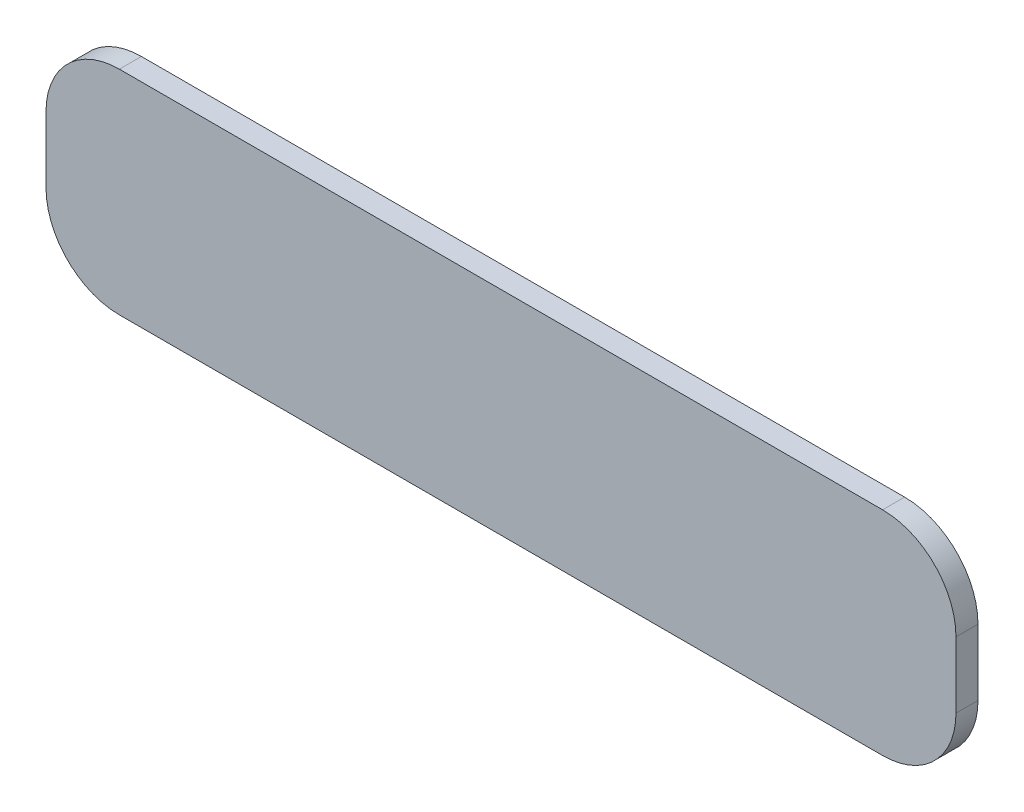
ISO-10303-21;
HEADER;
FILE_DESCRIPTION(('STEP AP214'),'2;1');
FILE_NAME('part.step','',(''),(''),'','','');
FILE_SCHEMA(('AUTOMOTIVE_DESIGN { 1 0 10303 214 1 1 1 1 }'));
ENDSEC;
DATA;
#1=APPLICATION_CONTEXT('core data for automotive mechanical design processes');
#2=APPLICATION_PROTOCOL_DEFINITION('international standard','automotive_design',2000,#1);
#3=PRODUCT_CONTEXT('',#1,'mechanical');
#4=PRODUCT('Part','Part','',(#3));
#5=PRODUCT_RELATED_PRODUCT_CATEGORY('part','',(#4));
#6=PRODUCT_DEFINITION_FORMATION('','',#4);
#7=PRODUCT_DEFINITION_CONTEXT('part definition',#1,'design');
#8=PRODUCT_DEFINITION('design','',#6,#7);
#9=PRODUCT_DEFINITION_SHAPE('','',#8);
#10=(LENGTH_UNIT() NAMED_UNIT(*) SI_UNIT(.MILLI.,.METRE.));
#11=(NAMED_UNIT(*) PLANE_ANGLE_UNIT() SI_UNIT($,.RADIAN.));
#12=(NAMED_UNIT(*) SI_UNIT($,.STERADIAN.) SOLID_ANGLE_UNIT());
#13=UNCERTAINTY_MEASURE_WITH_UNIT(LENGTH_MEASURE(1.E-05),#10,'distance_accuracy_value','');
#14=(GEOMETRIC_REPRESENTATION_CONTEXT(3) GLOBAL_UNCERTAINTY_ASSIGNED_CONTEXT((#13)) GLOBAL_UNIT_ASSIGNED_CONTEXT((#10,
#11,#12)) REPRESENTATION_CONTEXT('',''));
#15=CARTESIAN_POINT('',(0.,0.,0.));
#16=DIRECTION('',(0.,0.,1.));
#17=DIRECTION('',(1.,0.,0.));
#18=AXIS2_PLACEMENT_3D('',#15,#16,#17);
#19=CARTESIAN_POINT('',(-62.,14.5,3.));
#20=DIRECTION('',(1.,0.,0.));
#21=DIRECTION('',(0.,0.,-1.));
#22=AXIS2_PLACEMENT_3D('',#19,#20,#21);
#23=PLANE('',#22);
#24=DIRECTION('',(0.,-1.,0.));
#25=VECTOR('',#24,1.);
#26=CARTESIAN_POINT('',(-62.,14.5,0.));
#27=LINE('',#26,#25);
#28=CARTESIAN_POINT('',(-62.,4.5,0.));
#29=VERTEX_POINT('',#28);
#30=CARTESIAN_POINT('',(-62.,-4.5,0.));
#31=VERTEX_POINT('',#30);
#32=EDGE_CURVE('E158',#29,#31,#27,.T.);
#33=ORIENTED_EDGE('',*,*,#32,.T.);
#34=DIRECTION('',(0.,0.,-1.));
#35=VECTOR('',#34,1.);
#36=CARTESIAN_POINT('',(-62.,-4.5,3.));
#37=LINE('',#36,#35);
#38=CARTESIAN_POINT('',(-62.,-4.5,3.));
#39=VERTEX_POINT('',#38);
#40=EDGE_CURVE('E11',#31,#39,#37,.F.);
#41=ORIENTED_EDGE('',*,*,#40,.T.);
#42=DIRECTION('',(0.,-1.,0.));
#43=VECTOR('',#42,1.);
#44=CARTESIAN_POINT('',(-62.,14.5,3.));
#45=LINE('',#44,#43);
#46=CARTESIAN_POINT('',(-62.,4.5,3.));
#47=VERTEX_POINT('',#46);
#48=EDGE_CURVE('E126',#47,#39,#45,.T.);
#49=ORIENTED_EDGE('',*,*,#48,.F.);
#50=DIRECTION('',(0.,0.,-1.));
#51=VECTOR('',#50,1.);
#52=CARTESIAN_POINT('',(-62.,4.5,3.));
#53=LINE('',#52,#51);
#54=EDGE_CURVE('E42',#47,#29,#53,.T.);
#55=ORIENTED_EDGE('',*,*,#54,.T.);
#56=EDGE_LOOP('',(#33,#41,#49,#55));
#57=FACE_BOUND('',#56,.T.);
#58=ADVANCED_FACE('F34',(#57),#23,.F.);
#59=CARTESIAN_POINT('',(-62.,-14.5,3.));
#60=DIRECTION('',(0.,1.,0.));
#61=DIRECTION('',(0.,0.,1.));
#62=AXIS2_PLACEMENT_3D('',#59,#60,#61);
#63=PLANE('',#62);
#64=DIRECTION('',(1.,0.,0.));
#65=VECTOR('',#64,1.);
#66=CARTESIAN_POINT('',(-62.,-14.5,0.));
#67=LINE('',#66,#65);
#68=CARTESIAN_POINT('',(-52.,-14.5,0.));
#69=VERTEX_POINT('',#68);
#70=CARTESIAN_POINT('',(52.,-14.5,0.));
#71=VERTEX_POINT('',#70);
#72=EDGE_CURVE('E131',#69,#71,#67,.T.);
#73=ORIENTED_EDGE('',*,*,#72,.T.);
#74=DIRECTION('',(0.,0.,-1.));
#75=VECTOR('',#74,1.);
#76=CARTESIAN_POINT('',(52.,-14.5,3.));
#77=LINE('',#76,#75);
#78=CARTESIAN_POINT('',(52.,-14.5,3.));
#79=VERTEX_POINT('',#78);
#80=EDGE_CURVE('E49',#71,#79,#77,.F.);
#81=ORIENTED_EDGE('',*,*,#80,.T.);
#82=DIRECTION('',(1.,0.,0.));
#83=VECTOR('',#82,1.);
#84=CARTESIAN_POINT('',(-62.,-14.5,3.));
#85=LINE('',#84,#83);
#86=CARTESIAN_POINT('',(-52.,-14.5,3.));
#87=VERTEX_POINT('',#86);
#88=EDGE_CURVE('E129',#87,#79,#85,.T.);
#89=ORIENTED_EDGE('',*,*,#88,.F.);
#90=DIRECTION('',(0.,0.,-1.));
#91=VECTOR('',#90,1.);
#92=CARTESIAN_POINT('',(-52.,-14.5,3.));
#93=LINE('',#92,#91);
#94=EDGE_CURVE('E150',#87,#69,#93,.T.);
#95=ORIENTED_EDGE('',*,*,#94,.T.);
#96=EDGE_LOOP('',(#73,#81,#89,#95));
#97=FACE_BOUND('',#96,.T.);
#98=ADVANCED_FACE('F178',(#97),#63,.F.);
#99=CARTESIAN_POINT('',(62.,14.5,3.));
#100=DIRECTION('',(-1.,0.,0.));
#101=DIRECTION('',(0.,-1.,0.));
#102=AXIS2_PLACEMENT_3D('',#99,#100,#101);
#103=PLANE('',#102);
#104=DIRECTION('',(0.,1.,0.));
#105=VECTOR('',#104,1.);
#106=CARTESIAN_POINT('',(62.,14.5,0.));
#107=LINE('',#106,#105);
#108=CARTESIAN_POINT('',(62.,-4.49999999999999,0.));
#109=VERTEX_POINT('',#108);
#110=CARTESIAN_POINT('',(62.,4.50000000000001,0.));
#111=VERTEX_POINT('',#110);
#112=EDGE_CURVE('E127',#109,#111,#107,.T.);
#113=ORIENTED_EDGE('',*,*,#112,.T.);
#114=DIRECTION('',(0.,0.,-1.));
#115=VECTOR('',#114,1.);
#116=CARTESIAN_POINT('',(62.,4.5,3.));
#117=LINE('',#116,#115);
#118=CARTESIAN_POINT('',(62.,4.50000000000001,3.));
#119=VERTEX_POINT('',#118);
#120=EDGE_CURVE('E105',#111,#119,#117,.F.);
#121=ORIENTED_EDGE('',*,*,#120,.T.);
#122=DIRECTION('',(0.,1.,0.));
#123=VECTOR('',#122,1.);
#124=CARTESIAN_POINT('',(62.,14.5,3.));
#125=LINE('',#124,#123);
#126=CARTESIAN_POINT('',(62.,-4.49999999999999,3.));
#127=VERTEX_POINT('',#126);
#128=EDGE_CURVE('E166',#127,#119,#125,.T.);
#129=ORIENTED_EDGE('',*,*,#128,.F.);
#130=DIRECTION('',(0.,0.,-1.));
#131=VECTOR('',#130,1.);
#132=CARTESIAN_POINT('',(62.,-4.5,3.));
#133=LINE('',#132,#131);
#134=EDGE_CURVE('E110',#127,#109,#133,.T.);
#135=ORIENTED_EDGE('',*,*,#134,.T.);
#136=EDGE_LOOP('',(#113,#121,#129,#135));
#137=FACE_BOUND('',#136,.T.);
#138=ADVANCED_FACE('F177',(#137),#103,.F.);
#139=CARTESIAN_POINT('',(-62.,14.5,3.));
#140=DIRECTION('',(0.,-1.,0.));
#141=DIRECTION('',(0.,0.,-1.));
#142=AXIS2_PLACEMENT_3D('',#139,#140,#141);
#143=PLANE('',#142);
#144=DIRECTION('',(-1.,0.,0.));
#145=VECTOR('',#144,1.);
#146=CARTESIAN_POINT('',(-62.,14.5,3.));
#147=LINE('',#146,#145);
#148=CARTESIAN_POINT('',(52.,14.5,3.));
#149=VERTEX_POINT('',#148);
#150=CARTESIAN_POINT('',(-52.,14.5,3.));
#151=VERTEX_POINT('',#150);
#152=EDGE_CURVE('E120',#149,#151,#147,.T.);
#153=ORIENTED_EDGE('',*,*,#152,.F.);
#154=DIRECTION('',(0.,0.,-1.));
#155=VECTOR('',#154,1.);
#156=CARTESIAN_POINT('',(52.,14.5,3.));
#157=LINE('',#156,#155);
#158=CARTESIAN_POINT('',(52.,14.5,0.));
#159=VERTEX_POINT('',#158);
#160=EDGE_CURVE('E104',#149,#159,#157,.T.);
#161=ORIENTED_EDGE('',*,*,#160,.T.);
#162=DIRECTION('',(-1.,0.,0.));
#163=VECTOR('',#162,1.);
#164=CARTESIAN_POINT('',(-62.,14.5,0.));
#165=LINE('',#164,#163);
#166=CARTESIAN_POINT('',(-52.,14.5,0.));
#167=VERTEX_POINT('',#166);
#168=EDGE_CURVE('E117',#159,#167,#165,.T.);
#169=ORIENTED_EDGE('',*,*,#168,.T.);
#170=DIRECTION('',(0.,0.,-1.));
#171=VECTOR('',#170,1.);
#172=CARTESIAN_POINT('',(-52.,14.5,3.));
#173=LINE('',#172,#171);
#174=EDGE_CURVE('E122',#167,#151,#173,.F.);
#175=ORIENTED_EDGE('',*,*,#174,.T.);
#176=EDGE_LOOP('',(#153,#161,#169,#175));
#177=FACE_BOUND('',#176,.T.);
#178=ADVANCED_FACE('F116',(#177),#143,.F.);
#179=CARTESIAN_POINT('',(0.,0.,3.));
#180=DIRECTION('',(0.,0.,1.));
#181=DIRECTION('',(1.,0.,0.));
#182=AXIS2_PLACEMENT_3D('',#179,#180,#181);
#183=PLANE('',#182);
#184=ORIENTED_EDGE('',*,*,#128,.T.);
#185=CARTESIAN_POINT('',(52.,4.5,3.));
#186=DIRECTION('',(0.,0.,1.));
#187=DIRECTION('',(1.,0.,0.));
#188=AXIS2_PLACEMENT_3D('',#185,#186,#187);
#189=CIRCLE('',#188,10.);
#190=EDGE_CURVE('E148',#119,#149,#189,.T.);
#191=ORIENTED_EDGE('',*,*,#190,.T.);
#192=ORIENTED_EDGE('',*,*,#152,.T.);
#193=CARTESIAN_POINT('',(-52.,4.5,3.));
#194=DIRECTION('',(0.,0.,1.));
#195=DIRECTION('',(1.,0.,0.));
#196=AXIS2_PLACEMENT_3D('',#193,#194,#195);
#197=CIRCLE('',#196,10.);
#198=EDGE_CURVE('E143',#151,#47,#197,.T.);
#199=ORIENTED_EDGE('',*,*,#198,.T.);
#200=ORIENTED_EDGE('',*,*,#48,.T.);
#201=CARTESIAN_POINT('',(-52.,-4.5,3.));
#202=DIRECTION('',(0.,0.,1.));
#203=DIRECTION('',(1.,0.,0.));
#204=AXIS2_PLACEMENT_3D('',#201,#202,#203);
#205=CIRCLE('',#204,10.);
#206=EDGE_CURVE('E56',#39,#87,#205,.T.);
#207=ORIENTED_EDGE('',*,*,#206,.T.);
#208=ORIENTED_EDGE('',*,*,#88,.T.);
#209=CARTESIAN_POINT('',(52.,-4.5,3.));
#210=DIRECTION('',(0.,0.,1.));
#211=DIRECTION('',(1.,0.,0.));
#212=AXIS2_PLACEMENT_3D('',#209,#210,#211);
#213=CIRCLE('',#212,10.);
#214=EDGE_CURVE('E146',#79,#127,#213,.T.);
#215=ORIENTED_EDGE('',*,*,#214,.T.);
#216=EDGE_LOOP('',(#184,#191,#192,#199,#200,#207,#208,#215));
#217=FACE_BOUND('',#216,.T.);
#218=ADVANCED_FACE('F170',(#217),#183,.T.);
#219=CARTESIAN_POINT('',(0.,0.,0.));
#220=DIRECTION('',(0.,0.,1.));
#221=DIRECTION('',(1.,0.,0.));
#222=AXIS2_PLACEMENT_3D('',#219,#220,#221);
#223=PLANE('',#222);
#224=ORIENTED_EDGE('',*,*,#168,.F.);
#225=CARTESIAN_POINT('',(52.,4.5,0.));
#226=DIRECTION('',(0.,0.,1.));
#227=DIRECTION('',(1.,0.,0.));
#228=AXIS2_PLACEMENT_3D('',#225,#226,#227);
#229=CIRCLE('',#228,10.);
#230=EDGE_CURVE('E100',#159,#111,#229,.F.);
#231=ORIENTED_EDGE('',*,*,#230,.T.);
#232=ORIENTED_EDGE('',*,*,#112,.F.);
#233=CARTESIAN_POINT('',(52.,-4.5,0.));
#234=DIRECTION('',(0.,0.,1.));
#235=DIRECTION('',(1.,0.,0.));
#236=AXIS2_PLACEMENT_3D('',#233,#234,#235);
#237=CIRCLE('',#236,10.);
#238=EDGE_CURVE('E111',#109,#71,#237,.F.);
#239=ORIENTED_EDGE('',*,*,#238,.T.);
#240=ORIENTED_EDGE('',*,*,#72,.F.);
#241=CARTESIAN_POINT('',(-52.,-4.5,0.));
#242=DIRECTION('',(0.,0.,1.));
#243=DIRECTION('',(1.,0.,0.));
#244=AXIS2_PLACEMENT_3D('',#241,#242,#243);
#245=CIRCLE('',#244,10.);
#246=EDGE_CURVE('E137',#69,#31,#245,.F.);
#247=ORIENTED_EDGE('',*,*,#246,.T.);
#248=ORIENTED_EDGE('',*,*,#32,.F.);
#249=CARTESIAN_POINT('',(-52.,4.5,0.));
#250=DIRECTION('',(0.,0.,1.));
#251=DIRECTION('',(1.,0.,0.));
#252=AXIS2_PLACEMENT_3D('',#249,#250,#251);
#253=CIRCLE('',#252,10.);
#254=EDGE_CURVE('E121',#29,#167,#253,.F.);
#255=ORIENTED_EDGE('',*,*,#254,.T.);
#256=EDGE_LOOP('',(#224,#231,#232,#239,#240,#247,#248,#255));
#257=FACE_BOUND('',#256,.T.);
#258=ADVANCED_FACE('F124',(#257),#223,.F.);
#259=CARTESIAN_POINT('',(52.,4.5,3.));
#260=DIRECTION('',(0.,0.,-1.));
#261=DIRECTION('',(-1.,0.,0.));
#262=AXIS2_PLACEMENT_3D('',#259,#260,#261);
#263=CYLINDRICAL_SURFACE('',#262,10.);
#264=ORIENTED_EDGE('',*,*,#190,.F.);
#265=ORIENTED_EDGE('',*,*,#120,.F.);
#266=ORIENTED_EDGE('',*,*,#230,.F.);
#267=ORIENTED_EDGE('',*,*,#160,.F.);
#268=EDGE_LOOP('',(#264,#265,#266,#267));
#269=FACE_BOUND('',#268,.T.);
#270=ADVANCED_FACE('F103',(#269),#263,.T.);
#271=CARTESIAN_POINT('',(52.,-4.5,3.));
#272=DIRECTION('',(0.,0.,-1.));
#273=DIRECTION('',(-1.,0.,0.));
#274=AXIS2_PLACEMENT_3D('',#271,#272,#273);
#275=CYLINDRICAL_SURFACE('',#274,10.);
#276=ORIENTED_EDGE('',*,*,#214,.F.);
#277=ORIENTED_EDGE('',*,*,#80,.F.);
#278=ORIENTED_EDGE('',*,*,#238,.F.);
#279=ORIENTED_EDGE('',*,*,#134,.F.);
#280=EDGE_LOOP('',(#276,#277,#278,#279));
#281=FACE_BOUND('',#280,.T.);
#282=ADVANCED_FACE('F175',(#281),#275,.T.);
#283=CARTESIAN_POINT('',(-52.,-4.5,3.));
#284=DIRECTION('',(0.,0.,-1.));
#285=DIRECTION('',(-1.,0.,0.));
#286=AXIS2_PLACEMENT_3D('',#283,#284,#285);
#287=CYLINDRICAL_SURFACE('',#286,10.);
#288=ORIENTED_EDGE('',*,*,#206,.F.);
#289=ORIENTED_EDGE('',*,*,#40,.F.);
#290=ORIENTED_EDGE('',*,*,#246,.F.);
#291=ORIENTED_EDGE('',*,*,#94,.F.);
#292=EDGE_LOOP('',(#288,#289,#290,#291));
#293=FACE_BOUND('',#292,.T.);
#294=ADVANCED_FACE('F180',(#293),#287,.T.);
#295=CARTESIAN_POINT('',(-52.,4.5,3.));
#296=DIRECTION('',(0.,0.,-1.));
#297=DIRECTION('',(-1.,0.,0.));
#298=AXIS2_PLACEMENT_3D('',#295,#296,#297);
#299=CYLINDRICAL_SURFACE('',#298,10.);
#300=ORIENTED_EDGE('',*,*,#198,.F.);
#301=ORIENTED_EDGE('',*,*,#174,.F.);
#302=ORIENTED_EDGE('',*,*,#254,.F.);
#303=ORIENTED_EDGE('',*,*,#54,.F.);
#304=EDGE_LOOP('',(#300,#301,#302,#303));
#305=FACE_BOUND('',#304,.T.);
#306=ADVANCED_FACE('F36',(#305),#299,.T.);
#307=CLOSED_SHELL('',(#58,#98,#138,#178,#218,#258,#270,#282,#294,#306));
#308=MANIFOLD_SOLID_BREP('B2',#307);
#309=ADVANCED_BREP_SHAPE_REPRESENTATION('',(#18,#308),#14);
#310=SHAPE_DEFINITION_REPRESENTATION(#9,#309);
ENDSEC;
END-ISO-10303-21;
